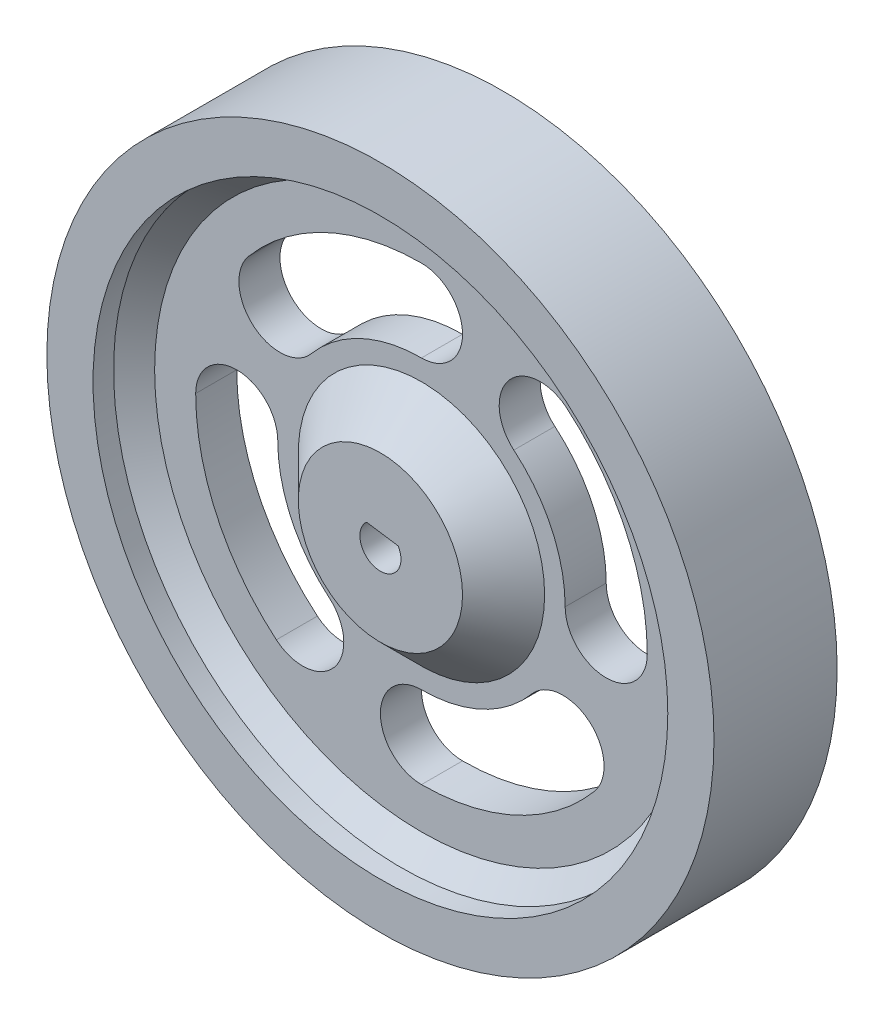
ISO-10303-21;
HEADER;
FILE_DESCRIPTION(('STEP AP214'),'2;1');
FILE_NAME('part.step','',(''),(''),'','','');
FILE_SCHEMA(('AUTOMOTIVE_DESIGN { 1 0 10303 214 1 1 1 1 }'));
ENDSEC;
DATA;
#1=APPLICATION_CONTEXT('core data for automotive mechanical design processes');
#2=APPLICATION_PROTOCOL_DEFINITION('international standard','automotive_design',2000,#1);
#3=PRODUCT_CONTEXT('',#1,'mechanical');
#4=PRODUCT('Part','Part','',(#3));
#5=PRODUCT_RELATED_PRODUCT_CATEGORY('part','',(#4));
#6=PRODUCT_DEFINITION_FORMATION('','',#4);
#7=PRODUCT_DEFINITION_CONTEXT('part definition',#1,'design');
#8=PRODUCT_DEFINITION('design','',#6,#7);
#9=PRODUCT_DEFINITION_SHAPE('','',#8);
#10=(LENGTH_UNIT() NAMED_UNIT(*) SI_UNIT(.MILLI.,.METRE.));
#11=(NAMED_UNIT(*) PLANE_ANGLE_UNIT() SI_UNIT($,.RADIAN.));
#12=(NAMED_UNIT(*) SI_UNIT($,.STERADIAN.) SOLID_ANGLE_UNIT());
#13=UNCERTAINTY_MEASURE_WITH_UNIT(LENGTH_MEASURE(1.E-05),#10,'distance_accuracy_value','');
#14=(GEOMETRIC_REPRESENTATION_CONTEXT(3) GLOBAL_UNCERTAINTY_ASSIGNED_CONTEXT((#13)) GLOBAL_UNIT_ASSIGNED_CONTEXT((#10,
#11,#12)) REPRESENTATION_CONTEXT('',''));
#15=CARTESIAN_POINT('',(0.,0.,0.));
#16=DIRECTION('',(0.,0.,1.));
#17=DIRECTION('',(1.,0.,0.));
#18=AXIS2_PLACEMENT_3D('',#15,#16,#17);
#19=CARTESIAN_POINT('',(-13.7887999761415,11.5701769743578,12.));
#20=DIRECTION('',(0.,0.,-1.));
#21=DIRECTION('',(-1.,0.,0.));
#22=AXIS2_PLACEMENT_3D('',#19,#20,#21);
#23=CYLINDRICAL_SURFACE('',#22,4.);
#24=DIRECTION('',(0.,0.,-1.));
#25=VECTOR('',#24,1.);
#26=CARTESIAN_POINT('',(-10.7246222036656,8.99902653561162,12.));
#27=LINE('',#26,#25);
#28=CARTESIAN_POINT('',(-10.7246222036656,8.99902653561162,8.));
#29=VERTEX_POINT('',#28);
#30=CARTESIAN_POINT('',(-10.7246222036656,8.99902653561162,4.));
#31=VERTEX_POINT('',#30);
#32=EDGE_CURVE('E231',#29,#31,#27,.T.);
#33=ORIENTED_EDGE('',*,*,#32,.T.);
#34=CARTESIAN_POINT('',(-13.7887999761415,11.5701769743578,4.));
#35=DIRECTION('',(0.,0.,-1.));
#36=DIRECTION('',(-1.,0.,0.));
#37=AXIS2_PLACEMENT_3D('',#34,#35,#36);
#38=CIRCLE('',#37,4.);
#39=CARTESIAN_POINT('',(-16.8529777486174,14.141327413104,4.));
#40=VERTEX_POINT('',#39);
#41=EDGE_CURVE('E396',#31,#40,#38,.T.);
#42=ORIENTED_EDGE('',*,*,#41,.T.);
#43=DIRECTION('',(0.,0.,-1.));
#44=VECTOR('',#43,1.);
#45=CARTESIAN_POINT('',(-16.8529777486174,14.141327413104,12.));
#46=LINE('',#45,#44);
#47=CARTESIAN_POINT('',(-16.8529777486174,14.141327413104,8.));
#48=VERTEX_POINT('',#47);
#49=EDGE_CURVE('E222',#48,#40,#46,.T.);
#50=ORIENTED_EDGE('',*,*,#49,.F.);
#51=CARTESIAN_POINT('',(-13.7887999761415,11.5701769743578,8.));
#52=DIRECTION('',(0.,0.,1.));
#53=DIRECTION('',(1.,0.,0.));
#54=AXIS2_PLACEMENT_3D('',#51,#52,#53);
#55=CIRCLE('',#54,4.);
#56=EDGE_CURVE('E186',#48,#29,#55,.T.);
#57=ORIENTED_EDGE('',*,*,#56,.T.);
#58=EDGE_LOOP('',(#33,#42,#50,#57));
#59=FACE_BOUND('',#58,.T.);
#60=ADVANCED_FACE('F33',(#59),#23,.F.);
#61=CARTESIAN_POINT('',(0.,0.,12.));
#62=DIRECTION('',(0.,0.,-1.));
#63=DIRECTION('',(-1.,0.,0.));
#64=AXIS2_PLACEMENT_3D('',#61,#62,#63);
#65=CYLINDRICAL_SURFACE('',#64,14.);
#66=DIRECTION('',(0.,0.,-1.));
#67=VECTOR('',#66,1.);
#68=CARTESIAN_POINT('',(0.,14.,12.));
#69=LINE('',#68,#67);
#70=CARTESIAN_POINT('',(0.,14.,8.));
#71=VERTEX_POINT('',#70);
#72=CARTESIAN_POINT('',(0.,14.,4.));
#73=VERTEX_POINT('',#72);
#74=EDGE_CURVE('E228',#71,#73,#69,.T.);
#75=ORIENTED_EDGE('',*,*,#74,.T.);
#76=CARTESIAN_POINT('',(0.,0.,4.));
#77=DIRECTION('',(0.,0.,-1.));
#78=DIRECTION('',(-1.,0.,0.));
#79=AXIS2_PLACEMENT_3D('',#76,#77,#78);
#80=CIRCLE('',#79,14.);
#81=EDGE_CURVE('E393',#73,#31,#80,.F.);
#82=ORIENTED_EDGE('',*,*,#81,.T.);
#83=ORIENTED_EDGE('',*,*,#32,.F.);
#84=CARTESIAN_POINT('',(0.,0.,8.));
#85=DIRECTION('',(0.,0.,1.));
#86=DIRECTION('',(1.,0.,0.));
#87=AXIS2_PLACEMENT_3D('',#84,#85,#86);
#88=CIRCLE('',#87,14.);
#89=EDGE_CURVE('E191',#29,#71,#88,.F.);
#90=ORIENTED_EDGE('',*,*,#89,.T.);
#91=EDGE_LOOP('',(#75,#82,#83,#90));
#92=FACE_BOUND('',#91,.T.);
#93=ADVANCED_FACE('F282',(#92),#65,.T.);
#94=CARTESIAN_POINT('',(0.,18.,12.));
#95=DIRECTION('',(0.,0.,-1.));
#96=DIRECTION('',(-1.,0.,0.));
#97=AXIS2_PLACEMENT_3D('',#94,#95,#96);
#98=CYLINDRICAL_SURFACE('',#97,4.);
#99=DIRECTION('',(0.,0.,-1.));
#100=VECTOR('',#99,1.);
#101=CARTESIAN_POINT('',(0.,22.,12.));
#102=LINE('',#101,#100);
#103=CARTESIAN_POINT('',(0.,22.,8.));
#104=VERTEX_POINT('',#103);
#105=CARTESIAN_POINT('',(0.,22.,4.));
#106=VERTEX_POINT('',#105);
#107=EDGE_CURVE('E225',#104,#106,#102,.T.);
#108=ORIENTED_EDGE('',*,*,#107,.T.);
#109=CARTESIAN_POINT('',(0.,18.,4.));
#110=DIRECTION('',(0.,0.,-1.));
#111=DIRECTION('',(-1.,0.,0.));
#112=AXIS2_PLACEMENT_3D('',#109,#110,#111);
#113=CIRCLE('',#112,4.);
#114=EDGE_CURVE('E48',#106,#73,#113,.T.);
#115=ORIENTED_EDGE('',*,*,#114,.T.);
#116=ORIENTED_EDGE('',*,*,#74,.F.);
#117=CARTESIAN_POINT('',(0.,18.,8.));
#118=DIRECTION('',(0.,0.,1.));
#119=DIRECTION('',(1.,0.,0.));
#120=AXIS2_PLACEMENT_3D('',#117,#118,#119);
#121=CIRCLE('',#120,4.);
#122=EDGE_CURVE('E386',#71,#104,#121,.T.);
#123=ORIENTED_EDGE('',*,*,#122,.T.);
#124=EDGE_LOOP('',(#108,#115,#116,#123));
#125=FACE_BOUND('',#124,.T.);
#126=ADVANCED_FACE('F288',(#125),#98,.F.);
#127=CARTESIAN_POINT('',(0.,0.,12.));
#128=DIRECTION('',(0.,0.,-1.));
#129=DIRECTION('',(-1.,0.,0.));
#130=AXIS2_PLACEMENT_3D('',#127,#128,#129);
#131=CYLINDRICAL_SURFACE('',#130,22.);
#132=ORIENTED_EDGE('',*,*,#49,.T.);
#133=CARTESIAN_POINT('',(0.,0.,4.));
#134=DIRECTION('',(0.,0.,-1.));
#135=DIRECTION('',(-1.,0.,0.));
#136=AXIS2_PLACEMENT_3D('',#133,#134,#135);
#137=CIRCLE('',#136,22.);
#138=EDGE_CURVE('E394',#40,#106,#137,.T.);
#139=ORIENTED_EDGE('',*,*,#138,.T.);
#140=ORIENTED_EDGE('',*,*,#107,.F.);
#141=CARTESIAN_POINT('',(0.,0.,8.));
#142=DIRECTION('',(0.,0.,1.));
#143=DIRECTION('',(1.,0.,0.));
#144=AXIS2_PLACEMENT_3D('',#141,#142,#143);
#145=CIRCLE('',#144,22.);
#146=EDGE_CURVE('E340',#104,#48,#145,.T.);
#147=ORIENTED_EDGE('',*,*,#146,.T.);
#148=EDGE_LOOP('',(#132,#139,#140,#147));
#149=FACE_BOUND('',#148,.T.);
#150=ADVANCED_FACE('F498',(#149),#131,.F.);
#151=CARTESIAN_POINT('',(11.5701769743578,13.7887999761415,12.));
#152=DIRECTION('',(0.,0.,-1.));
#153=DIRECTION('',(-1.,0.,0.));
#154=AXIS2_PLACEMENT_3D('',#151,#152,#153);
#155=CYLINDRICAL_SURFACE('',#154,4.);
#156=DIRECTION('',(0.,0.,-1.));
#157=VECTOR('',#156,1.);
#158=CARTESIAN_POINT('',(8.99902653561162,10.7246222036656,12.));
#159=LINE('',#158,#157);
#160=CARTESIAN_POINT('',(8.99902653561162,10.7246222036656,8.));
#161=VERTEX_POINT('',#160);
#162=CARTESIAN_POINT('',(8.99902653561162,10.7246222036656,4.));
#163=VERTEX_POINT('',#162);
#164=EDGE_CURVE('E219',#161,#163,#159,.T.);
#165=ORIENTED_EDGE('',*,*,#164,.T.);
#166=CARTESIAN_POINT('',(11.5701769743578,13.7887999761415,4.));
#167=DIRECTION('',(0.,0.,-1.));
#168=DIRECTION('',(-1.,0.,0.));
#169=AXIS2_PLACEMENT_3D('',#166,#167,#168);
#170=CIRCLE('',#169,4.);
#171=CARTESIAN_POINT('',(14.141327413104,16.8529777486174,4.));
#172=VERTEX_POINT('',#171);
#173=EDGE_CURVE('E398',#163,#172,#170,.T.);
#174=ORIENTED_EDGE('',*,*,#173,.T.);
#175=DIRECTION('',(0.,0.,-1.));
#176=VECTOR('',#175,1.);
#177=CARTESIAN_POINT('',(14.141327413104,16.8529777486174,12.));
#178=LINE('',#177,#176);
#179=CARTESIAN_POINT('',(14.141327413104,16.8529777486174,8.));
#180=VERTEX_POINT('',#179);
#181=EDGE_CURVE('E210',#180,#172,#178,.T.);
#182=ORIENTED_EDGE('',*,*,#181,.F.);
#183=CARTESIAN_POINT('',(11.5701769743578,13.7887999761415,8.));
#184=DIRECTION('',(0.,0.,1.));
#185=DIRECTION('',(1.,0.,0.));
#186=AXIS2_PLACEMENT_3D('',#183,#184,#185);
#187=CIRCLE('',#186,4.);
#188=EDGE_CURVE('E382',#180,#161,#187,.T.);
#189=ORIENTED_EDGE('',*,*,#188,.T.);
#190=EDGE_LOOP('',(#165,#174,#182,#189));
#191=FACE_BOUND('',#190,.T.);
#192=ADVANCED_FACE('F452',(#191),#155,.F.);
#193=CARTESIAN_POINT('',(0.,0.,12.));
#194=DIRECTION('',(0.,0.,-1.));
#195=DIRECTION('',(-1.,0.,0.));
#196=AXIS2_PLACEMENT_3D('',#193,#194,#195);
#197=CYLINDRICAL_SURFACE('',#196,14.);
#198=DIRECTION('',(0.,0.,-1.));
#199=VECTOR('',#198,1.);
#200=CARTESIAN_POINT('',(14.,0.,12.));
#201=LINE('',#200,#199);
#202=CARTESIAN_POINT('',(14.,0.,8.));
#203=VERTEX_POINT('',#202);
#204=CARTESIAN_POINT('',(14.,0.,4.));
#205=VERTEX_POINT('',#204);
#206=EDGE_CURVE('E216',#203,#205,#201,.T.);
#207=ORIENTED_EDGE('',*,*,#206,.T.);
#208=CARTESIAN_POINT('',(0.,0.,4.));
#209=DIRECTION('',(0.,0.,-1.));
#210=DIRECTION('',(-1.,0.,0.));
#211=AXIS2_PLACEMENT_3D('',#208,#209,#210);
#212=CIRCLE('',#211,14.);
#213=EDGE_CURVE('E447',#205,#163,#212,.F.);
#214=ORIENTED_EDGE('',*,*,#213,.T.);
#215=ORIENTED_EDGE('',*,*,#164,.F.);
#216=CARTESIAN_POINT('',(0.,0.,8.));
#217=DIRECTION('',(0.,0.,1.));
#218=DIRECTION('',(1.,0.,0.));
#219=AXIS2_PLACEMENT_3D('',#216,#217,#218);
#220=CIRCLE('',#219,14.);
#221=EDGE_CURVE('E379',#161,#203,#220,.F.);
#222=ORIENTED_EDGE('',*,*,#221,.T.);
#223=EDGE_LOOP('',(#207,#214,#215,#222));
#224=FACE_BOUND('',#223,.T.);
#225=ADVANCED_FACE('F461',(#224),#197,.T.);
#226=CARTESIAN_POINT('',(18.,0.,12.));
#227=DIRECTION('',(0.,0.,-1.));
#228=DIRECTION('',(-1.,0.,0.));
#229=AXIS2_PLACEMENT_3D('',#226,#227,#228);
#230=CYLINDRICAL_SURFACE('',#229,4.);
#231=DIRECTION('',(0.,0.,-1.));
#232=VECTOR('',#231,1.);
#233=CARTESIAN_POINT('',(22.,0.,12.));
#234=LINE('',#233,#232);
#235=CARTESIAN_POINT('',(22.,0.,8.));
#236=VERTEX_POINT('',#235);
#237=CARTESIAN_POINT('',(22.,0.,4.));
#238=VERTEX_POINT('',#237);
#239=EDGE_CURVE('E213',#236,#238,#234,.T.);
#240=ORIENTED_EDGE('',*,*,#239,.T.);
#241=CARTESIAN_POINT('',(18.,0.,4.));
#242=DIRECTION('',(0.,0.,-1.));
#243=DIRECTION('',(-1.,0.,0.));
#244=AXIS2_PLACEMENT_3D('',#241,#242,#243);
#245=CIRCLE('',#244,4.);
#246=EDGE_CURVE('E56',#238,#205,#245,.T.);
#247=ORIENTED_EDGE('',*,*,#246,.T.);
#248=ORIENTED_EDGE('',*,*,#206,.F.);
#249=CARTESIAN_POINT('',(18.,0.,8.));
#250=DIRECTION('',(0.,0.,1.));
#251=DIRECTION('',(1.,0.,0.));
#252=AXIS2_PLACEMENT_3D('',#249,#250,#251);
#253=CIRCLE('',#252,4.);
#254=EDGE_CURVE('E377',#203,#236,#253,.T.);
#255=ORIENTED_EDGE('',*,*,#254,.T.);
#256=EDGE_LOOP('',(#240,#247,#248,#255));
#257=FACE_BOUND('',#256,.T.);
#258=ADVANCED_FACE('F458',(#257),#230,.F.);
#259=CARTESIAN_POINT('',(0.,0.,12.));
#260=DIRECTION('',(0.,0.,-1.));
#261=DIRECTION('',(-1.,0.,0.));
#262=AXIS2_PLACEMENT_3D('',#259,#260,#261);
#263=CYLINDRICAL_SURFACE('',#262,22.);
#264=ORIENTED_EDGE('',*,*,#181,.T.);
#265=CARTESIAN_POINT('',(0.,0.,4.));
#266=DIRECTION('',(0.,0.,-1.));
#267=DIRECTION('',(-1.,0.,0.));
#268=AXIS2_PLACEMENT_3D('',#265,#266,#267);
#269=CIRCLE('',#268,22.);
#270=EDGE_CURVE('E444',#172,#238,#269,.T.);
#271=ORIENTED_EDGE('',*,*,#270,.T.);
#272=ORIENTED_EDGE('',*,*,#239,.F.);
#273=CARTESIAN_POINT('',(0.,0.,8.));
#274=DIRECTION('',(0.,0.,1.));
#275=DIRECTION('',(1.,0.,0.));
#276=AXIS2_PLACEMENT_3D('',#273,#274,#275);
#277=CIRCLE('',#276,22.);
#278=EDGE_CURVE('E344',#236,#180,#277,.T.);
#279=ORIENTED_EDGE('',*,*,#278,.T.);
#280=EDGE_LOOP('',(#264,#271,#272,#279));
#281=FACE_BOUND('',#280,.T.);
#282=ADVANCED_FACE('F455',(#281),#263,.F.);
#283=CARTESIAN_POINT('',(13.7887999761415,-11.5701769743578,12.));
#284=DIRECTION('',(0.,0.,-1.));
#285=DIRECTION('',(-1.,0.,0.));
#286=AXIS2_PLACEMENT_3D('',#283,#284,#285);
#287=CYLINDRICAL_SURFACE('',#286,4.);
#288=DIRECTION('',(0.,0.,-1.));
#289=VECTOR('',#288,1.);
#290=CARTESIAN_POINT('',(10.7246222036656,-8.99902653561161,12.));
#291=LINE('',#290,#289);
#292=CARTESIAN_POINT('',(10.7246222036656,-8.99902653561161,8.));
#293=VERTEX_POINT('',#292);
#294=CARTESIAN_POINT('',(10.7246222036656,-8.99902653561161,4.));
#295=VERTEX_POINT('',#294);
#296=EDGE_CURVE('E207',#293,#295,#291,.T.);
#297=ORIENTED_EDGE('',*,*,#296,.T.);
#298=CARTESIAN_POINT('',(13.7887999761415,-11.5701769743578,4.));
#299=DIRECTION('',(0.,0.,-1.));
#300=DIRECTION('',(-1.,0.,0.));
#301=AXIS2_PLACEMENT_3D('',#298,#299,#300);
#302=CIRCLE('',#301,4.);
#303=CARTESIAN_POINT('',(16.8529777486174,-14.141327413104,4.));
#304=VERTEX_POINT('',#303);
#305=EDGE_CURVE('E441',#295,#304,#302,.T.);
#306=ORIENTED_EDGE('',*,*,#305,.T.);
#307=DIRECTION('',(0.,0.,-1.));
#308=VECTOR('',#307,1.);
#309=CARTESIAN_POINT('',(16.8529777486174,-14.141327413104,12.));
#310=LINE('',#309,#308);
#311=CARTESIAN_POINT('',(16.8529777486174,-14.141327413104,8.));
#312=VERTEX_POINT('',#311);
#313=EDGE_CURVE('E198',#312,#304,#310,.T.);
#314=ORIENTED_EDGE('',*,*,#313,.F.);
#315=CARTESIAN_POINT('',(13.7887999761415,-11.5701769743578,8.));
#316=DIRECTION('',(0.,0.,1.));
#317=DIRECTION('',(1.,0.,0.));
#318=AXIS2_PLACEMENT_3D('',#315,#316,#317);
#319=CIRCLE('',#318,4.);
#320=EDGE_CURVE('E373',#312,#293,#319,.T.);
#321=ORIENTED_EDGE('',*,*,#320,.T.);
#322=EDGE_LOOP('',(#297,#306,#314,#321));
#323=FACE_BOUND('',#322,.T.);
#324=ADVANCED_FACE('F472',(#323),#287,.F.);
#325=CARTESIAN_POINT('',(0.,0.,12.));
#326=DIRECTION('',(0.,0.,-1.));
#327=DIRECTION('',(-1.,0.,0.));
#328=AXIS2_PLACEMENT_3D('',#325,#326,#327);
#329=CYLINDRICAL_SURFACE('',#328,14.);
#330=DIRECTION('',(0.,0.,-1.));
#331=VECTOR('',#330,1.);
#332=CARTESIAN_POINT('',(0.,-14.,12.));
#333=LINE('',#332,#331);
#334=CARTESIAN_POINT('',(0.,-14.,8.));
#335=VERTEX_POINT('',#334);
#336=CARTESIAN_POINT('',(0.,-14.,4.));
#337=VERTEX_POINT('',#336);
#338=EDGE_CURVE('E204',#335,#337,#333,.T.);
#339=ORIENTED_EDGE('',*,*,#338,.T.);
#340=CARTESIAN_POINT('',(0.,0.,4.));
#341=DIRECTION('',(0.,0.,-1.));
#342=DIRECTION('',(-1.,0.,0.));
#343=AXIS2_PLACEMENT_3D('',#340,#341,#342);
#344=CIRCLE('',#343,14.);
#345=EDGE_CURVE('E438',#337,#295,#344,.F.);
#346=ORIENTED_EDGE('',*,*,#345,.T.);
#347=ORIENTED_EDGE('',*,*,#296,.F.);
#348=CARTESIAN_POINT('',(0.,0.,8.));
#349=DIRECTION('',(0.,0.,1.));
#350=DIRECTION('',(1.,0.,0.));
#351=AXIS2_PLACEMENT_3D('',#348,#349,#350);
#352=CIRCLE('',#351,14.);
#353=EDGE_CURVE('E370',#293,#335,#352,.F.);
#354=ORIENTED_EDGE('',*,*,#353,.T.);
#355=EDGE_LOOP('',(#339,#346,#347,#354));
#356=FACE_BOUND('',#355,.T.);
#357=ADVANCED_FACE('F469',(#356),#329,.T.);
#358=CARTESIAN_POINT('',(0.,-18.,12.));
#359=DIRECTION('',(0.,0.,-1.));
#360=DIRECTION('',(-1.,0.,0.));
#361=AXIS2_PLACEMENT_3D('',#358,#359,#360);
#362=CYLINDRICAL_SURFACE('',#361,4.);
#363=DIRECTION('',(0.,0.,-1.));
#364=VECTOR('',#363,1.);
#365=CARTESIAN_POINT('',(0.,-22.,12.));
#366=LINE('',#365,#364);
#367=CARTESIAN_POINT('',(0.,-22.,8.));
#368=VERTEX_POINT('',#367);
#369=CARTESIAN_POINT('',(0.,-22.,4.));
#370=VERTEX_POINT('',#369);
#371=EDGE_CURVE('E201',#368,#370,#366,.T.);
#372=ORIENTED_EDGE('',*,*,#371,.T.);
#373=CARTESIAN_POINT('',(0.,-18.,4.));
#374=DIRECTION('',(0.,0.,-1.));
#375=DIRECTION('',(-1.,0.,0.));
#376=AXIS2_PLACEMENT_3D('',#373,#374,#375);
#377=CIRCLE('',#376,4.);
#378=EDGE_CURVE('E435',#370,#337,#377,.T.);
#379=ORIENTED_EDGE('',*,*,#378,.T.);
#380=ORIENTED_EDGE('',*,*,#338,.F.);
#381=CARTESIAN_POINT('',(0.,-18.,8.));
#382=DIRECTION('',(0.,0.,1.));
#383=DIRECTION('',(1.,0.,0.));
#384=AXIS2_PLACEMENT_3D('',#381,#382,#383);
#385=CIRCLE('',#384,4.);
#386=EDGE_CURVE('E368',#335,#368,#385,.T.);
#387=ORIENTED_EDGE('',*,*,#386,.T.);
#388=EDGE_LOOP('',(#372,#379,#380,#387));
#389=FACE_BOUND('',#388,.T.);
#390=ADVANCED_FACE('F467',(#389),#362,.F.);
#391=CARTESIAN_POINT('',(0.,0.,12.));
#392=DIRECTION('',(0.,0.,-1.));
#393=DIRECTION('',(-1.,0.,0.));
#394=AXIS2_PLACEMENT_3D('',#391,#392,#393);
#395=CYLINDRICAL_SURFACE('',#394,22.);
#396=ORIENTED_EDGE('',*,*,#313,.T.);
#397=CARTESIAN_POINT('',(0.,0.,4.));
#398=DIRECTION('',(0.,0.,-1.));
#399=DIRECTION('',(-1.,0.,0.));
#400=AXIS2_PLACEMENT_3D('',#397,#398,#399);
#401=CIRCLE('',#400,22.);
#402=EDGE_CURVE('E179',#304,#370,#401,.T.);
#403=ORIENTED_EDGE('',*,*,#402,.T.);
#404=ORIENTED_EDGE('',*,*,#371,.F.);
#405=CARTESIAN_POINT('',(0.,0.,8.));
#406=DIRECTION('',(0.,0.,1.));
#407=DIRECTION('',(1.,0.,0.));
#408=AXIS2_PLACEMENT_3D('',#405,#406,#407);
#409=CIRCLE('',#408,22.);
#410=EDGE_CURVE('E348',#368,#312,#409,.T.);
#411=ORIENTED_EDGE('',*,*,#410,.T.);
#412=EDGE_LOOP('',(#396,#403,#404,#411));
#413=FACE_BOUND('',#412,.T.);
#414=ADVANCED_FACE('F474',(#413),#395,.F.);
#415=CARTESIAN_POINT('',(-11.5701769743578,-13.7887999761415,12.));
#416=DIRECTION('',(0.,0.,-1.));
#417=DIRECTION('',(-1.,0.,0.));
#418=AXIS2_PLACEMENT_3D('',#415,#416,#417);
#419=CYLINDRICAL_SURFACE('',#418,4.);
#420=DIRECTION('',(0.,0.,-1.));
#421=VECTOR('',#420,1.);
#422=CARTESIAN_POINT('',(-8.99902653561161,-10.7246222036656,12.));
#423=LINE('',#422,#421);
#424=CARTESIAN_POINT('',(-8.99902653561161,-10.7246222036656,8.));
#425=VERTEX_POINT('',#424);
#426=CARTESIAN_POINT('',(-8.99902653561161,-10.7246222036656,4.));
#427=VERTEX_POINT('',#426);
#428=EDGE_CURVE('E178',#425,#427,#423,.T.);
#429=ORIENTED_EDGE('',*,*,#428,.T.);
#430=CARTESIAN_POINT('',(-11.5701769743578,-13.7887999761415,4.));
#431=DIRECTION('',(0.,0.,-1.));
#432=DIRECTION('',(-1.,0.,0.));
#433=AXIS2_PLACEMENT_3D('',#430,#431,#432);
#434=CIRCLE('',#433,4.);
#435=CARTESIAN_POINT('',(-14.141327413104,-16.8529777486174,4.));
#436=VERTEX_POINT('',#435);
#437=EDGE_CURVE('E160',#427,#436,#434,.T.);
#438=ORIENTED_EDGE('',*,*,#437,.T.);
#439=DIRECTION('',(0.,0.,-1.));
#440=VECTOR('',#439,1.);
#441=CARTESIAN_POINT('',(-14.141327413104,-16.8529777486174,12.));
#442=LINE('',#441,#440);
#443=CARTESIAN_POINT('',(-14.141327413104,-16.8529777486174,8.));
#444=VERTEX_POINT('',#443);
#445=EDGE_CURVE('E176',#444,#436,#442,.T.);
#446=ORIENTED_EDGE('',*,*,#445,.F.);
#447=CARTESIAN_POINT('',(-11.5701769743578,-13.7887999761415,8.));
#448=DIRECTION('',(0.,0.,1.));
#449=DIRECTION('',(1.,0.,0.));
#450=AXIS2_PLACEMENT_3D('',#447,#448,#449);
#451=CIRCLE('',#450,4.);
#452=EDGE_CURVE('E353',#444,#425,#451,.T.);
#453=ORIENTED_EDGE('',*,*,#452,.T.);
#454=EDGE_LOOP('',(#429,#438,#446,#453));
#455=FACE_BOUND('',#454,.T.);
#456=ADVANCED_FACE('F174',(#455),#419,.F.);
#457=CARTESIAN_POINT('',(0.,0.,12.));
#458=DIRECTION('',(0.,0.,-1.));
#459=DIRECTION('',(-1.,0.,0.));
#460=AXIS2_PLACEMENT_3D('',#457,#458,#459);
#461=CYLINDRICAL_SURFACE('',#460,14.);
#462=DIRECTION('',(0.,0.,-1.));
#463=VECTOR('',#462,1.);
#464=CARTESIAN_POINT('',(-14.,0.,12.));
#465=LINE('',#464,#463);
#466=CARTESIAN_POINT('',(-14.,0.,8.));
#467=VERTEX_POINT('',#466);
#468=CARTESIAN_POINT('',(-14.,0.,4.));
#469=VERTEX_POINT('',#468);
#470=EDGE_CURVE('E188',#467,#469,#465,.T.);
#471=ORIENTED_EDGE('',*,*,#470,.T.);
#472=CARTESIAN_POINT('',(0.,0.,4.));
#473=DIRECTION('',(0.,0.,-1.));
#474=DIRECTION('',(-1.,0.,0.));
#475=AXIS2_PLACEMENT_3D('',#472,#473,#474);
#476=CIRCLE('',#475,14.);
#477=EDGE_CURVE('E180',#469,#427,#476,.F.);
#478=ORIENTED_EDGE('',*,*,#477,.T.);
#479=ORIENTED_EDGE('',*,*,#428,.F.);
#480=CARTESIAN_POINT('',(0.,0.,8.));
#481=DIRECTION('',(0.,0.,1.));
#482=DIRECTION('',(1.,0.,0.));
#483=AXIS2_PLACEMENT_3D('',#480,#481,#482);
#484=CIRCLE('',#483,14.);
#485=EDGE_CURVE('E357',#425,#467,#484,.F.);
#486=ORIENTED_EDGE('',*,*,#485,.T.);
#487=EDGE_LOOP('',(#471,#478,#479,#486));
#488=FACE_BOUND('',#487,.T.);
#489=ADVANCED_FACE('F481',(#488),#461,.T.);
#490=CARTESIAN_POINT('',(-18.,0.,12.));
#491=DIRECTION('',(0.,0.,-1.));
#492=DIRECTION('',(-1.,0.,0.));
#493=AXIS2_PLACEMENT_3D('',#490,#491,#492);
#494=CYLINDRICAL_SURFACE('',#493,4.);
#495=DIRECTION('',(0.,0.,-1.));
#496=VECTOR('',#495,1.);
#497=CARTESIAN_POINT('',(-22.,0.,12.));
#498=LINE('',#497,#496);
#499=CARTESIAN_POINT('',(-22.,0.,8.));
#500=VERTEX_POINT('',#499);
#501=CARTESIAN_POINT('',(-22.,0.,4.));
#502=VERTEX_POINT('',#501);
#503=EDGE_CURVE('E185',#500,#502,#498,.T.);
#504=ORIENTED_EDGE('',*,*,#503,.T.);
#505=CARTESIAN_POINT('',(-18.,0.,4.));
#506=DIRECTION('',(0.,0.,-1.));
#507=DIRECTION('',(-1.,0.,0.));
#508=AXIS2_PLACEMENT_3D('',#505,#506,#507);
#509=CIRCLE('',#508,4.);
#510=EDGE_CURVE('E163',#502,#469,#509,.T.);
#511=ORIENTED_EDGE('',*,*,#510,.T.);
#512=ORIENTED_EDGE('',*,*,#470,.F.);
#513=CARTESIAN_POINT('',(-18.,0.,8.));
#514=DIRECTION('',(0.,0.,1.));
#515=DIRECTION('',(1.,0.,0.));
#516=AXIS2_PLACEMENT_3D('',#513,#514,#515);
#517=CIRCLE('',#516,4.);
#518=EDGE_CURVE('E351',#467,#500,#517,.T.);
#519=ORIENTED_EDGE('',*,*,#518,.T.);
#520=EDGE_LOOP('',(#504,#511,#512,#519));
#521=FACE_BOUND('',#520,.T.);
#522=ADVANCED_FACE('F356',(#521),#494,.F.);
#523=CARTESIAN_POINT('',(0.,0.,12.));
#524=DIRECTION('',(0.,0.,-1.));
#525=DIRECTION('',(-1.,0.,0.));
#526=AXIS2_PLACEMENT_3D('',#523,#524,#525);
#527=CYLINDRICAL_SURFACE('',#526,22.);
#528=ORIENTED_EDGE('',*,*,#445,.T.);
#529=CARTESIAN_POINT('',(0.,0.,4.));
#530=DIRECTION('',(0.,0.,-1.));
#531=DIRECTION('',(-1.,0.,0.));
#532=AXIS2_PLACEMENT_3D('',#529,#530,#531);
#533=CIRCLE('',#532,22.);
#534=EDGE_CURVE('E157',#436,#502,#533,.T.);
#535=ORIENTED_EDGE('',*,*,#534,.T.);
#536=ORIENTED_EDGE('',*,*,#503,.F.);
#537=CARTESIAN_POINT('',(0.,0.,8.));
#538=DIRECTION('',(0.,0.,1.));
#539=DIRECTION('',(1.,0.,0.));
#540=AXIS2_PLACEMENT_3D('',#537,#538,#539);
#541=CIRCLE('',#540,22.);
#542=EDGE_CURVE('E184',#500,#444,#541,.T.);
#543=ORIENTED_EDGE('',*,*,#542,.T.);
#544=EDGE_LOOP('',(#528,#535,#536,#543));
#545=FACE_BOUND('',#544,.T.);
#546=ADVANCED_FACE('F183',(#545),#527,.F.);
#547=CARTESIAN_POINT('',(0.,0.,0.));
#548=DIRECTION('',(0.,0.,1.));
#549=DIRECTION('',(1.,0.,0.));
#550=AXIS2_PLACEMENT_3D('',#547,#548,#549);
#551=PLANE('',#550);
#552=CARTESIAN_POINT('',(0.,0.,0.));
#553=DIRECTION('',(0.,0.,1.));
#554=DIRECTION('',(1.,0.,0.));
#555=AXIS2_PLACEMENT_3D('',#552,#553,#554);
#556=CIRCLE('',#555,32.5);
#557=CARTESIAN_POINT('',(32.5,0.,0.));
#558=VERTEX_POINT('',#557);
#559=EDGE_CURVE('E251',#558,#558,#556,.T.);
#560=ORIENTED_EDGE('',*,*,#559,.F.);
#561=EDGE_LOOP('',(#560));
#562=FACE_BOUND('',#561,.T.);
#563=CARTESIAN_POINT('',(0.,0.,0.));
#564=DIRECTION('',(0.,0.,1.));
#565=DIRECTION('',(1.,0.,0.));
#566=AXIS2_PLACEMENT_3D('',#563,#564,#565);
#567=CIRCLE('',#566,28.);
#568=CARTESIAN_POINT('',(28.,0.,0.));
#569=VERTEX_POINT('',#568);
#570=EDGE_CURVE('E425',#569,#569,#567,.T.);
#571=ORIENTED_EDGE('',*,*,#570,.T.);
#572=EDGE_LOOP('',(#571));
#573=FACE_BOUND('',#572,.T.);
#574=ADVANCED_FACE('F312',(#562,#573),#551,.F.);
#575=CARTESIAN_POINT('',(0.,0.,12.));
#576=DIRECTION('',(0.,0.,1.));
#577=DIRECTION('',(1.,0.,0.));
#578=AXIS2_PLACEMENT_3D('',#575,#576,#577);
#579=PLANE('',#578);
#580=DIRECTION('',(-0.988526795142464,0.15104560664041,0.));
#581=VECTOR('',#580,1.);
#582=CARTESIAN_POINT('',(-1.35452995595645,1.47147837171214,12.));
#583=LINE('',#582,#581);
#584=CARTESIAN_POINT('',(1.73214397255748,0.99983861614402,12.));
#585=VERTEX_POINT('',#584);
#586=CARTESIAN_POINT('',(-1.35452995595645,1.47147837171214,12.));
#587=VERTEX_POINT('',#586);
#588=EDGE_CURVE('E238',#585,#587,#583,.T.);
#589=ORIENTED_EDGE('',*,*,#588,.F.);
#590=CARTESIAN_POINT('',(0.,0.,12.));
#591=DIRECTION('',(0.,0.,1.));
#592=DIRECTION('',(1.,0.,0.));
#593=AXIS2_PLACEMENT_3D('',#590,#591,#592);
#594=CIRCLE('',#593,2.);
#595=EDGE_CURVE('E235',#587,#585,#594,.T.);
#596=ORIENTED_EDGE('',*,*,#595,.F.);
#597=EDGE_LOOP('',(#589,#596));
#598=FACE_BOUND('',#597,.T.);
#599=CARTESIAN_POINT('',(0.,0.,12.));
#600=DIRECTION('',(0.,0.,1.));
#601=DIRECTION('',(1.,0.,0.));
#602=AXIS2_PLACEMENT_3D('',#599,#600,#601);
#603=CIRCLE('',#602,8.);
#604=CARTESIAN_POINT('',(8.,0.,12.));
#605=VERTEX_POINT('',#604);
#606=EDGE_CURVE('E362',#605,#605,#603,.T.);
#607=ORIENTED_EDGE('',*,*,#606,.T.);
#608=EDGE_LOOP('',(#607));
#609=FACE_BOUND('',#608,.T.);
#610=ADVANCED_FACE('F307',(#598,#609),#579,.T.);
#611=CARTESIAN_POINT('',(0.,0.,12.));
#612=DIRECTION('',(0.,0.,1.));
#613=DIRECTION('',(1.,0.,0.));
#614=AXIS2_PLACEMENT_3D('',#611,#612,#613);
#615=CIRCLE('',#614,28.);
#616=CARTESIAN_POINT('',(28.,0.,12.));
#617=VERTEX_POINT('',#616);
#618=EDGE_CURVE('E358',#617,#617,#615,.T.);
#619=ORIENTED_EDGE('',*,*,#618,.F.);
#620=EDGE_LOOP('',(#619));
#621=FACE_BOUND('',#620,.T.);
#622=CARTESIAN_POINT('',(0.,0.,12.));
#623=DIRECTION('',(0.,0.,1.));
#624=DIRECTION('',(1.,0.,0.));
#625=AXIS2_PLACEMENT_3D('',#622,#623,#624);
#626=CIRCLE('',#625,32.5);
#627=CARTESIAN_POINT('',(32.5,0.,12.));
#628=VERTEX_POINT('',#627);
#629=EDGE_CURVE('E252',#628,#628,#626,.T.);
#630=ORIENTED_EDGE('',*,*,#629,.T.);
#631=EDGE_LOOP('',(#630));
#632=FACE_BOUND('',#631,.T.);
#633=ADVANCED_FACE('F303',(#621,#632),#579,.T.);
#634=CARTESIAN_POINT('',(0.,0.,0.));
#635=DIRECTION('',(0.,0.,1.));
#636=DIRECTION('',(1.,0.,0.));
#637=AXIS2_PLACEMENT_3D('',#634,#635,#636);
#638=CIRCLE('',#637,8.);
#639=CARTESIAN_POINT('',(8.,0.,0.));
#640=VERTEX_POINT('',#639);
#641=EDGE_CURVE('E426',#640,#640,#638,.T.);
#642=ORIENTED_EDGE('',*,*,#641,.F.);
#643=EDGE_LOOP('',(#642));
#644=FACE_BOUND('',#643,.T.);
#645=CARTESIAN_POINT('',(0.,0.,0.));
#646=DIRECTION('',(0.,0.,1.));
#647=DIRECTION('',(1.,0.,0.));
#648=AXIS2_PLACEMENT_3D('',#645,#646,#647);
#649=CIRCLE('',#648,2.);
#650=CARTESIAN_POINT('',(-1.35452995595645,1.47147837171214,0.));
#651=VERTEX_POINT('',#650);
#652=CARTESIAN_POINT('',(1.73214397255748,0.999838616144021,0.));
#653=VERTEX_POINT('',#652);
#654=EDGE_CURVE('E234',#651,#653,#649,.T.);
#655=ORIENTED_EDGE('',*,*,#654,.T.);
#656=DIRECTION('',(-0.988526795142464,0.15104560664041,0.));
#657=VECTOR('',#656,1.);
#658=CARTESIAN_POINT('',(-1.35452995595645,1.47147837171214,0.));
#659=LINE('',#658,#657);
#660=EDGE_CURVE('E239',#653,#651,#659,.T.);
#661=ORIENTED_EDGE('',*,*,#660,.T.);
#662=EDGE_LOOP('',(#655,#661));
#663=FACE_BOUND('',#662,.T.);
#664=ADVANCED_FACE('F306',(#644,#663),#551,.F.);
#665=CARTESIAN_POINT('',(0.,0.,12.));
#666=DIRECTION('',(0.,0.,-1.));
#667=DIRECTION('',(-1.,0.,0.));
#668=AXIS2_PLACEMENT_3D('',#665,#666,#667);
#669=CYLINDRICAL_SURFACE('',#668,32.5);
#670=ORIENTED_EDGE('',*,*,#629,.F.);
#671=EDGE_LOOP('',(#670));
#672=FACE_BOUND('',#671,.T.);
#673=ORIENTED_EDGE('',*,*,#559,.T.);
#674=EDGE_LOOP('',(#673));
#675=FACE_BOUND('',#674,.T.);
#676=ADVANCED_FACE('F301',(#672,#675),#669,.T.);
#677=CARTESIAN_POINT('',(0.,0.,12.));
#678=DIRECTION('',(0.,0.,-1.));
#679=DIRECTION('',(-1.,0.,0.));
#680=AXIS2_PLACEMENT_3D('',#677,#678,#679);
#681=CYLINDRICAL_SURFACE('',#680,2.);
#682=ORIENTED_EDGE('',*,*,#654,.F.);
#683=DIRECTION('',(0.,0.,-1.));
#684=VECTOR('',#683,1.);
#685=CARTESIAN_POINT('',(-1.35452995595645,1.47147837171214,12.));
#686=LINE('',#685,#684);
#687=EDGE_CURVE('E241',#587,#651,#686,.T.);
#688=ORIENTED_EDGE('',*,*,#687,.F.);
#689=ORIENTED_EDGE('',*,*,#595,.T.);
#690=DIRECTION('',(0.,0.,-1.));
#691=VECTOR('',#690,1.);
#692=CARTESIAN_POINT('',(1.73214397255748,0.999838616144021,12.));
#693=LINE('',#692,#691);
#694=EDGE_CURVE('E248',#585,#653,#693,.T.);
#695=ORIENTED_EDGE('',*,*,#694,.T.);
#696=EDGE_LOOP('',(#682,#688,#689,#695));
#697=FACE_BOUND('',#696,.T.);
#698=ADVANCED_FACE('F297',(#697),#681,.F.);
#699=CARTESIAN_POINT('',(-1.35452995595645,1.47147837171214,12.));
#700=DIRECTION('',(-0.15104560664041,-0.988526795142464,0.));
#701=DIRECTION('',(0.988526795142464,-0.15104560664041,0.));
#702=AXIS2_PLACEMENT_3D('',#699,#700,#701);
#703=PLANE('',#702);
#704=ORIENTED_EDGE('',*,*,#660,.F.);
#705=ORIENTED_EDGE('',*,*,#694,.F.);
#706=ORIENTED_EDGE('',*,*,#588,.T.);
#707=ORIENTED_EDGE('',*,*,#687,.T.);
#708=EDGE_LOOP('',(#704,#705,#706,#707));
#709=FACE_BOUND('',#708,.T.);
#710=ADVANCED_FACE('F293',(#709),#703,.T.);
#711=CARTESIAN_POINT('',(0.,0.,8.));
#712=DIRECTION('',(0.,0.,1.));
#713=DIRECTION('',(1.,0.,0.));
#714=AXIS2_PLACEMENT_3D('',#711,#712,#713);
#715=CYLINDRICAL_SURFACE('',#714,28.);
#716=CARTESIAN_POINT('',(0.,0.,9.99999999999998));
#717=DIRECTION('',(0.,0.,1.));
#718=DIRECTION('',(1.,0.,0.));
#719=AXIS2_PLACEMENT_3D('',#716,#717,#718);
#720=CIRCLE('',#719,28.);
#721=CARTESIAN_POINT('',(28.,0.,9.99999999999998));
#722=VERTEX_POINT('',#721);
#723=EDGE_CURVE('E169',#722,#722,#720,.F.);
#724=ORIENTED_EDGE('',*,*,#723,.T.);
#725=EDGE_LOOP('',(#724));
#726=FACE_BOUND('',#725,.T.);
#727=ORIENTED_EDGE('',*,*,#618,.T.);
#728=EDGE_LOOP('',(#727));
#729=FACE_BOUND('',#728,.T.);
#730=ADVANCED_FACE('F296',(#726,#729),#715,.F.);
#731=CARTESIAN_POINT('',(0.,0.,8.));
#732=DIRECTION('',(0.,0.,1.));
#733=DIRECTION('',(1.,0.,0.));
#734=AXIS2_PLACEMENT_3D('',#731,#732,#733);
#735=PLANE('',#734);
#736=CARTESIAN_POINT('',(0.,0.,8.));
#737=DIRECTION('',(0.,0.,1.));
#738=DIRECTION('',(1.,0.,0.));
#739=AXIS2_PLACEMENT_3D('',#736,#737,#738);
#740=CIRCLE('',#739,26.);
#741=CARTESIAN_POINT('',(26.,0.,8.));
#742=VERTEX_POINT('',#741);
#743=EDGE_CURVE('E261',#742,#742,#740,.T.);
#744=ORIENTED_EDGE('',*,*,#743,.T.);
#745=EDGE_LOOP('',(#744));
#746=FACE_BOUND('',#745,.T.);
#747=CARTESIAN_POINT('',(0.,0.,8.));
#748=DIRECTION('',(0.,0.,1.));
#749=DIRECTION('',(1.,0.,0.));
#750=AXIS2_PLACEMENT_3D('',#747,#748,#749);
#751=CIRCLE('',#750,12.);
#752=CARTESIAN_POINT('',(12.,0.,8.));
#753=VERTEX_POINT('',#752);
#754=EDGE_CURVE('E258',#753,#753,#751,.F.);
#755=ORIENTED_EDGE('',*,*,#754,.T.);
#756=EDGE_LOOP('',(#755));
#757=FACE_BOUND('',#756,.T.);
#758=ORIENTED_EDGE('',*,*,#146,.F.);
#759=ORIENTED_EDGE('',*,*,#122,.F.);
#760=ORIENTED_EDGE('',*,*,#89,.F.);
#761=ORIENTED_EDGE('',*,*,#56,.F.);
#762=EDGE_LOOP('',(#758,#759,#760,#761));
#763=FACE_BOUND('',#762,.T.);
#764=ORIENTED_EDGE('',*,*,#278,.F.);
#765=ORIENTED_EDGE('',*,*,#254,.F.);
#766=ORIENTED_EDGE('',*,*,#221,.F.);
#767=ORIENTED_EDGE('',*,*,#188,.F.);
#768=EDGE_LOOP('',(#764,#765,#766,#767));
#769=FACE_BOUND('',#768,.T.);
#770=ORIENTED_EDGE('',*,*,#410,.F.);
#771=ORIENTED_EDGE('',*,*,#386,.F.);
#772=ORIENTED_EDGE('',*,*,#353,.F.);
#773=ORIENTED_EDGE('',*,*,#320,.F.);
#774=EDGE_LOOP('',(#770,#771,#772,#773));
#775=FACE_BOUND('',#774,.T.);
#776=ORIENTED_EDGE('',*,*,#542,.F.);
#777=ORIENTED_EDGE('',*,*,#518,.F.);
#778=ORIENTED_EDGE('',*,*,#485,.F.);
#779=ORIENTED_EDGE('',*,*,#452,.F.);
#780=EDGE_LOOP('',(#776,#777,#778,#779));
#781=FACE_BOUND('',#780,.T.);
#782=ADVANCED_FACE('F320',(#746,#757,#763,#769,#775,#781),#735,.T.);
#783=CARTESIAN_POINT('',(0.,0.,12.));
#784=DIRECTION('',(0.,0.,-1.));
#785=DIRECTION('',(-1.,0.,0.));
#786=AXIS2_PLACEMENT_3D('',#783,#784,#785);
#787=CONICAL_SURFACE('',#786,8.,0.785398163397443);
#788=ORIENTED_EDGE('',*,*,#754,.F.);
#789=EDGE_LOOP('',(#788));
#790=FACE_BOUND('',#789,.T.);
#791=ORIENTED_EDGE('',*,*,#606,.F.);
#792=EDGE_LOOP('',(#791));
#793=FACE_BOUND('',#792,.T.);
#794=ADVANCED_FACE('F316',(#790,#793),#787,.T.);
#795=CARTESIAN_POINT('',(0.,0.,8.));
#796=DIRECTION('',(0.,0.,1.));
#797=DIRECTION('',(1.,0.,0.));
#798=AXIS2_PLACEMENT_3D('',#795,#796,#797);
#799=CONICAL_SURFACE('',#798,26.,0.785398163397454);
#800=ORIENTED_EDGE('',*,*,#723,.F.);
#801=EDGE_LOOP('',(#800));
#802=FACE_BOUND('',#801,.T.);
#803=ORIENTED_EDGE('',*,*,#743,.F.);
#804=EDGE_LOOP('',(#803));
#805=FACE_BOUND('',#804,.T.);
#806=ADVANCED_FACE('F319',(#802,#805),#799,.F.);
#807=CARTESIAN_POINT('',(0.,0.,4.));
#808=DIRECTION('',(0.,0.,-1.));
#809=DIRECTION('',(1.,0.,0.));
#810=AXIS2_PLACEMENT_3D('',#807,#808,#809);
#811=PLANE('',#810);
#812=CARTESIAN_POINT('',(0.,0.,4.));
#813=DIRECTION('',(0.,0.,-1.));
#814=DIRECTION('',(-1.,0.,0.));
#815=AXIS2_PLACEMENT_3D('',#812,#813,#814);
#816=CIRCLE('',#815,26.);
#817=CARTESIAN_POINT('',(-26.,0.,4.));
#818=VERTEX_POINT('',#817);
#819=EDGE_CURVE('E11',#818,#818,#816,.T.);
#820=ORIENTED_EDGE('',*,*,#819,.T.);
#821=EDGE_LOOP('',(#820));
#822=FACE_BOUND('',#821,.T.);
#823=CARTESIAN_POINT('',(0.,0.,4.));
#824=DIRECTION('',(0.,0.,-1.));
#825=DIRECTION('',(-1.,0.,0.));
#826=AXIS2_PLACEMENT_3D('',#823,#824,#825);
#827=CIRCLE('',#826,12.0000000000001);
#828=CARTESIAN_POINT('',(-12.0000000000001,0.,4.));
#829=VERTEX_POINT('',#828);
#830=EDGE_CURVE('E168',#829,#829,#827,.F.);
#831=ORIENTED_EDGE('',*,*,#830,.T.);
#832=EDGE_LOOP('',(#831));
#833=FACE_BOUND('',#832,.T.);
#834=ORIENTED_EDGE('',*,*,#81,.F.);
#835=ORIENTED_EDGE('',*,*,#114,.F.);
#836=ORIENTED_EDGE('',*,*,#138,.F.);
#837=ORIENTED_EDGE('',*,*,#41,.F.);
#838=EDGE_LOOP('',(#834,#835,#836,#837));
#839=FACE_BOUND('',#838,.T.);
#840=ORIENTED_EDGE('',*,*,#213,.F.);
#841=ORIENTED_EDGE('',*,*,#246,.F.);
#842=ORIENTED_EDGE('',*,*,#270,.F.);
#843=ORIENTED_EDGE('',*,*,#173,.F.);
#844=EDGE_LOOP('',(#840,#841,#842,#843));
#845=FACE_BOUND('',#844,.T.);
#846=ORIENTED_EDGE('',*,*,#345,.F.);
#847=ORIENTED_EDGE('',*,*,#378,.F.);
#848=ORIENTED_EDGE('',*,*,#402,.F.);
#849=ORIENTED_EDGE('',*,*,#305,.F.);
#850=EDGE_LOOP('',(#846,#847,#848,#849));
#851=FACE_BOUND('',#850,.T.);
#852=ORIENTED_EDGE('',*,*,#477,.F.);
#853=ORIENTED_EDGE('',*,*,#510,.F.);
#854=ORIENTED_EDGE('',*,*,#534,.F.);
#855=ORIENTED_EDGE('',*,*,#437,.F.);
#856=EDGE_LOOP('',(#852,#853,#854,#855));
#857=FACE_BOUND('',#856,.T.);
#858=ADVANCED_FACE('F159',(#822,#833,#839,#845,#851,#857),#811,.T.);
#859=CARTESIAN_POINT('',(0.,0.,4.));
#860=DIRECTION('',(0.,0.,-1.));
#861=DIRECTION('',(-1.,0.,0.));
#862=AXIS2_PLACEMENT_3D('',#859,#860,#861);
#863=CYLINDRICAL_SURFACE('',#862,28.);
#864=CARTESIAN_POINT('',(0.,0.,1.99999999999996));
#865=DIRECTION('',(0.,0.,-1.));
#866=DIRECTION('',(-1.,0.,0.));
#867=AXIS2_PLACEMENT_3D('',#864,#865,#866);
#868=CIRCLE('',#867,28.);
#869=CARTESIAN_POINT('',(-28.,0.,1.99999999999996));
#870=VERTEX_POINT('',#869);
#871=EDGE_CURVE('E41',#870,#870,#868,.F.);
#872=ORIENTED_EDGE('',*,*,#871,.T.);
#873=EDGE_LOOP('',(#872));
#874=FACE_BOUND('',#873,.T.);
#875=ORIENTED_EDGE('',*,*,#570,.F.);
#876=EDGE_LOOP('',(#875));
#877=FACE_BOUND('',#876,.T.);
#878=ADVANCED_FACE('F270',(#874,#877),#863,.F.);
#879=CARTESIAN_POINT('',(0.,0.,4.));
#880=DIRECTION('',(0.,0.,1.));
#881=DIRECTION('',(1.,0.,0.));
#882=AXIS2_PLACEMENT_3D('',#879,#880,#881);
#883=CONICAL_SURFACE('',#882,12.0000000000001,0.785398163397453);
#884=ORIENTED_EDGE('',*,*,#641,.T.);
#885=EDGE_LOOP('',(#884));
#886=FACE_BOUND('',#885,.T.);
#887=ORIENTED_EDGE('',*,*,#830,.F.);
#888=EDGE_LOOP('',(#887));
#889=FACE_BOUND('',#888,.T.);
#890=ADVANCED_FACE('F274',(#886,#889),#883,.T.);
#891=CARTESIAN_POINT('',(0.,0.,1.99999999999996));
#892=DIRECTION('',(0.,0.,-1.));
#893=DIRECTION('',(-1.,0.,0.));
#894=AXIS2_PLACEMENT_3D('',#891,#892,#893);
#895=CONICAL_SURFACE('',#894,28.,0.785398163397443);
#896=ORIENTED_EDGE('',*,*,#819,.F.);
#897=EDGE_LOOP('',(#896));
#898=FACE_BOUND('',#897,.T.);
#899=ORIENTED_EDGE('',*,*,#871,.F.);
#900=EDGE_LOOP('',(#899));
#901=FACE_BOUND('',#900,.T.);
#902=ADVANCED_FACE('F35',(#898,#901),#895,.F.);
#903=CLOSED_SHELL('',(#60,#93,#126,#150,#192,#225,#258,#282,#324,#357,#390,#414,#456,#489,#522,
#546,#574,#610,#633,#664,#676,#698,#710,#730,#782,#794,#806,#858,#878,#890,#902));
#904=MANIFOLD_SOLID_BREP('B2',#903);
#905=ADVANCED_BREP_SHAPE_REPRESENTATION('',(#18,#904),#14);
#906=SHAPE_DEFINITION_REPRESENTATION(#9,#905);
ENDSEC;
END-ISO-10303-21;
